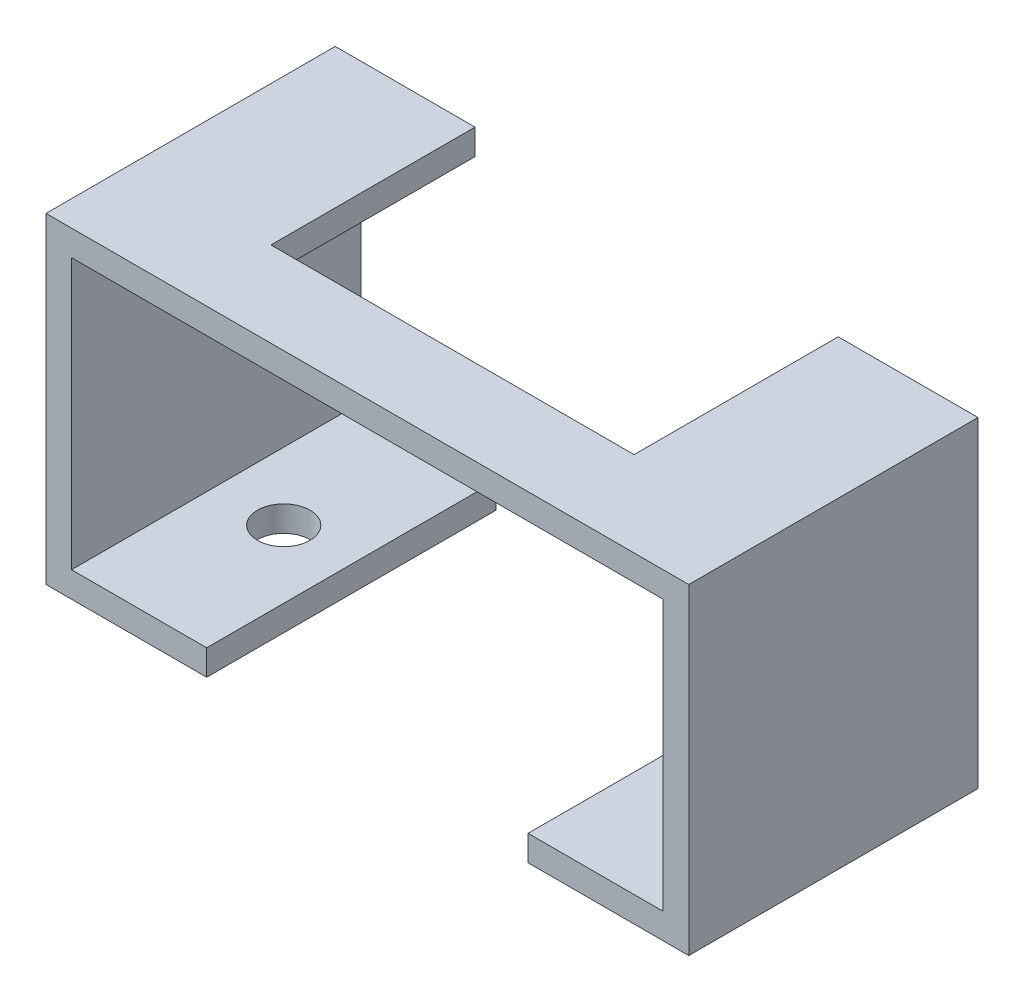
ISO-10303-21;
HEADER;
FILE_DESCRIPTION(('STEP AP214'),'2;1');
FILE_NAME('part.step','',(''),(''),'','','');
FILE_SCHEMA(('AUTOMOTIVE_DESIGN { 1 0 10303 214 1 1 1 1 }'));
ENDSEC;
DATA;
#1=APPLICATION_CONTEXT('core data for automotive mechanical design processes');
#2=APPLICATION_PROTOCOL_DEFINITION('international standard','automotive_design',2000,#1);
#3=PRODUCT_CONTEXT('',#1,'mechanical');
#4=PRODUCT('Part','Part','',(#3));
#5=PRODUCT_RELATED_PRODUCT_CATEGORY('part','',(#4));
#6=PRODUCT_DEFINITION_FORMATION('','',#4);
#7=PRODUCT_DEFINITION_CONTEXT('part definition',#1,'design');
#8=PRODUCT_DEFINITION('design','',#6,#7);
#9=PRODUCT_DEFINITION_SHAPE('','',#8);
#10=(LENGTH_UNIT() NAMED_UNIT(*) SI_UNIT(.MILLI.,.METRE.));
#11=(NAMED_UNIT(*) PLANE_ANGLE_UNIT() SI_UNIT($,.RADIAN.));
#12=(NAMED_UNIT(*) SI_UNIT($,.STERADIAN.) SOLID_ANGLE_UNIT());
#13=UNCERTAINTY_MEASURE_WITH_UNIT(LENGTH_MEASURE(1.E-05),#10,'distance_accuracy_value','');
#14=(GEOMETRIC_REPRESENTATION_CONTEXT(3) GLOBAL_UNCERTAINTY_ASSIGNED_CONTEXT((#13)) GLOBAL_UNIT_ASSIGNED_CONTEXT((#10,
#11,#12)) REPRESENTATION_CONTEXT('',''));
#15=CARTESIAN_POINT('',(0.,0.,0.));
#16=DIRECTION('',(0.,0.,1.));
#17=DIRECTION('',(1.,0.,0.));
#18=AXIS2_PLACEMENT_3D('',#15,#16,#17);
#19=CARTESIAN_POINT('',(0.,0.,0.));
#20=DIRECTION('',(0.,0.,1.));
#21=DIRECTION('',(1.,0.,0.));
#22=AXIS2_PLACEMENT_3D('',#19,#20,#21);
#23=PLANE('',#22);
#24=DIRECTION('',(1.,0.,0.));
#25=VECTOR('',#24,1.);
#26=CARTESIAN_POINT('',(1.59,-1.59,0.));
#27=LINE('',#26,#25);
#28=CARTESIAN_POINT('',(31.3,-1.59,0.));
#29=VERTEX_POINT('',#28);
#30=CARTESIAN_POINT('',(38.41,-1.59,0.));
#31=VERTEX_POINT('',#30);
#32=EDGE_CURVE('E175',#29,#31,#27,.T.);
#33=ORIENTED_EDGE('',*,*,#32,.F.);
#34=DIRECTION('',(0.,1.,0.));
#35=VECTOR('',#34,1.);
#36=CARTESIAN_POINT('',(31.3,0.,0.));
#37=LINE('',#36,#35);
#38=CARTESIAN_POINT('',(31.3,0.,0.));
#39=VERTEX_POINT('',#38);
#40=EDGE_CURVE('E11',#29,#39,#37,.T.);
#41=ORIENTED_EDGE('',*,*,#40,.T.);
#42=DIRECTION('',(-1.,0.,0.));
#43=VECTOR('',#42,1.);
#44=CARTESIAN_POINT('',(0.,0.,0.));
#45=LINE('',#44,#43);
#46=CARTESIAN_POINT('',(40.,0.,0.));
#47=VERTEX_POINT('',#46);
#48=EDGE_CURVE('E189',#47,#39,#45,.T.);
#49=ORIENTED_EDGE('',*,*,#48,.F.);
#50=DIRECTION('',(0.,1.,0.));
#51=VECTOR('',#50,1.);
#52=CARTESIAN_POINT('',(40.,0.,0.));
#53=LINE('',#52,#51);
#54=CARTESIAN_POINT('',(40.,-20.,0.));
#55=VERTEX_POINT('',#54);
#56=EDGE_CURVE('E187',#55,#47,#53,.T.);
#57=ORIENTED_EDGE('',*,*,#56,.F.);
#58=DIRECTION('',(1.,0.,0.));
#59=VECTOR('',#58,1.);
#60=CARTESIAN_POINT('',(40.,-20.,0.));
#61=LINE('',#60,#59);
#62=CARTESIAN_POINT('',(30.,-20.,0.));
#63=VERTEX_POINT('',#62);
#64=EDGE_CURVE('E185',#63,#55,#61,.T.);
#65=ORIENTED_EDGE('',*,*,#64,.F.);
#66=DIRECTION('',(0.,-1.,0.));
#67=VECTOR('',#66,1.);
#68=CARTESIAN_POINT('',(30.,-20.,0.));
#69=LINE('',#68,#67);
#70=CARTESIAN_POINT('',(30.,-18.41,0.));
#71=VERTEX_POINT('',#70);
#72=EDGE_CURVE('E183',#71,#63,#69,.T.);
#73=ORIENTED_EDGE('',*,*,#72,.F.);
#74=DIRECTION('',(-1.,0.,0.));
#75=VECTOR('',#74,1.);
#76=CARTESIAN_POINT('',(38.41,-18.41,0.));
#77=LINE('',#76,#75);
#78=CARTESIAN_POINT('',(38.41,-18.41,0.));
#79=VERTEX_POINT('',#78);
#80=EDGE_CURVE('E181',#79,#71,#77,.T.);
#81=ORIENTED_EDGE('',*,*,#80,.F.);
#82=DIRECTION('',(0.,-1.,0.));
#83=VECTOR('',#82,1.);
#84=CARTESIAN_POINT('',(38.41,-1.59,0.));
#85=LINE('',#84,#83);
#86=EDGE_CURVE('E179',#31,#79,#85,.T.);
#87=ORIENTED_EDGE('',*,*,#86,.F.);
#88=EDGE_LOOP('',(#33,#41,#49,#57,#65,#73,#81,#87));
#89=FACE_BOUND('',#88,.T.);
#90=ADVANCED_FACE('F32',(#89),#23,.F.);
#91=CARTESIAN_POINT('',(10.,-20.,18.));
#92=DIRECTION('',(-1.,0.,0.));
#93=DIRECTION('',(0.,0.,1.));
#94=AXIS2_PLACEMENT_3D('',#91,#92,#93);
#95=PLANE('',#94);
#96=DIRECTION('',(0.,1.,0.));
#97=VECTOR('',#96,1.);
#98=CARTESIAN_POINT('',(10.,-20.,0.));
#99=LINE('',#98,#97);
#100=CARTESIAN_POINT('',(10.,-20.,0.));
#101=VERTEX_POINT('',#100);
#102=CARTESIAN_POINT('',(10.,-18.41,0.));
#103=VERTEX_POINT('',#102);
#104=EDGE_CURVE('E167',#101,#103,#99,.T.);
#105=ORIENTED_EDGE('',*,*,#104,.T.);
#106=DIRECTION('',(0.,0.,-1.));
#107=VECTOR('',#106,1.);
#108=CARTESIAN_POINT('',(10.,-18.41,18.));
#109=LINE('',#108,#107);
#110=CARTESIAN_POINT('',(10.,-18.41,18.));
#111=VERTEX_POINT('',#110);
#112=EDGE_CURVE('E219',#111,#103,#109,.T.);
#113=ORIENTED_EDGE('',*,*,#112,.F.);
#114=DIRECTION('',(0.,1.,0.));
#115=VECTOR('',#114,1.);
#116=CARTESIAN_POINT('',(10.,-20.,18.));
#117=LINE('',#116,#115);
#118=CARTESIAN_POINT('',(10.,-20.,18.));
#119=VERTEX_POINT('',#118);
#120=EDGE_CURVE('E194',#119,#111,#117,.T.);
#121=ORIENTED_EDGE('',*,*,#120,.F.);
#122=DIRECTION('',(0.,0.,-1.));
#123=VECTOR('',#122,1.);
#124=CARTESIAN_POINT('',(10.,-20.,18.));
#125=LINE('',#124,#123);
#126=EDGE_CURVE('E163',#119,#101,#125,.T.);
#127=ORIENTED_EDGE('',*,*,#126,.T.);
#128=EDGE_LOOP('',(#105,#113,#121,#127));
#129=FACE_BOUND('',#128,.T.);
#130=ADVANCED_FACE('F34',(#129),#95,.F.);
#131=CARTESIAN_POINT('',(10.,-18.41,18.));
#132=DIRECTION('',(0.,-1.,0.));
#133=DIRECTION('',(0.,0.,-1.));
#134=AXIS2_PLACEMENT_3D('',#131,#132,#133);
#135=PLANE('',#134);
#136=CARTESIAN_POINT('',(5.795,-18.41,9.));
#137=DIRECTION('',(0.,1.,0.));
#138=DIRECTION('',(0.,0.,1.));
#139=AXIS2_PLACEMENT_3D('',#136,#137,#138);
#140=CIRCLE('',#139,1.63194999999999);
#141=CARTESIAN_POINT('',(5.795,-18.41,10.63195));
#142=VERTEX_POINT('',#141);
#143=EDGE_CURVE('E302',#142,#142,#140,.T.);
#144=ORIENTED_EDGE('',*,*,#143,.F.);
#145=EDGE_LOOP('',(#144));
#146=FACE_BOUND('',#145,.T.);
#147=DIRECTION('',(-1.,0.,0.));
#148=VECTOR('',#147,1.);
#149=CARTESIAN_POINT('',(10.,-18.41,0.));
#150=LINE('',#149,#148);
#151=CARTESIAN_POINT('',(1.59,-18.41,0.));
#152=VERTEX_POINT('',#151);
#153=EDGE_CURVE('E170',#103,#152,#150,.T.);
#154=ORIENTED_EDGE('',*,*,#153,.T.);
#155=DIRECTION('',(0.,0.,-1.));
#156=VECTOR('',#155,1.);
#157=CARTESIAN_POINT('',(1.59,-18.41,18.));
#158=LINE('',#157,#156);
#159=CARTESIAN_POINT('',(1.59,-18.41,18.));
#160=VERTEX_POINT('',#159);
#161=EDGE_CURVE('E216',#160,#152,#158,.T.);
#162=ORIENTED_EDGE('',*,*,#161,.F.);
#163=DIRECTION('',(-1.,0.,0.));
#164=VECTOR('',#163,1.);
#165=CARTESIAN_POINT('',(10.,-18.41,18.));
#166=LINE('',#165,#164);
#167=EDGE_CURVE('E110',#111,#160,#166,.T.);
#168=ORIENTED_EDGE('',*,*,#167,.F.);
#169=ORIENTED_EDGE('',*,*,#112,.T.);
#170=EDGE_LOOP('',(#154,#162,#168,#169));
#171=FACE_BOUND('',#170,.T.);
#172=ADVANCED_FACE('F240',(#146,#171),#135,.F.);
#173=CARTESIAN_POINT('',(1.59,-18.41,18.));
#174=DIRECTION('',(-1.,0.,0.));
#175=DIRECTION('',(0.,-1.,0.));
#176=AXIS2_PLACEMENT_3D('',#173,#174,#175);
#177=PLANE('',#176);
#178=DIRECTION('',(0.,1.,0.));
#179=VECTOR('',#178,1.);
#180=CARTESIAN_POINT('',(1.59,-18.41,0.));
#181=LINE('',#180,#179);
#182=CARTESIAN_POINT('',(1.59,-1.59,0.));
#183=VERTEX_POINT('',#182);
#184=EDGE_CURVE('E173',#152,#183,#181,.T.);
#185=ORIENTED_EDGE('',*,*,#184,.T.);
#186=DIRECTION('',(0.,0.,-1.));
#187=VECTOR('',#186,1.);
#188=CARTESIAN_POINT('',(1.59,-1.59,18.));
#189=LINE('',#188,#187);
#190=CARTESIAN_POINT('',(1.59,-1.59,18.));
#191=VERTEX_POINT('',#190);
#192=EDGE_CURVE('E213',#191,#183,#189,.T.);
#193=ORIENTED_EDGE('',*,*,#192,.F.);
#194=DIRECTION('',(0.,1.,0.));
#195=VECTOR('',#194,1.);
#196=CARTESIAN_POINT('',(1.59,-18.41,18.));
#197=LINE('',#196,#195);
#198=EDGE_CURVE('E237',#160,#191,#197,.T.);
#199=ORIENTED_EDGE('',*,*,#198,.F.);
#200=ORIENTED_EDGE('',*,*,#161,.T.);
#201=EDGE_LOOP('',(#185,#193,#199,#200));
#202=FACE_BOUND('',#201,.T.);
#203=ADVANCED_FACE('F236',(#202),#177,.F.);
#204=CARTESIAN_POINT('',(1.59,-1.59,18.));
#205=DIRECTION('',(0.,1.,0.));
#206=DIRECTION('',(0.,0.,1.));
#207=AXIS2_PLACEMENT_3D('',#204,#205,#206);
#208=PLANE('',#207);
#209=DIRECTION('',(1.,0.,0.));
#210=VECTOR('',#209,1.);
#211=CARTESIAN_POINT('',(1.59,-1.59,12.7));
#212=LINE('',#211,#210);
#213=CARTESIAN_POINT('',(8.7,-1.59,12.7));
#214=VERTEX_POINT('',#213);
#215=CARTESIAN_POINT('',(31.3,-1.59,12.7));
#216=VERTEX_POINT('',#215);
#217=EDGE_CURVE('E171',#214,#216,#212,.T.);
#218=ORIENTED_EDGE('',*,*,#217,.T.);
#219=DIRECTION('',(0.,0.,-1.));
#220=VECTOR('',#219,1.);
#221=CARTESIAN_POINT('',(31.3,-1.59,18.));
#222=LINE('',#221,#220);
#223=EDGE_CURVE('E319',#216,#29,#222,.T.);
#224=ORIENTED_EDGE('',*,*,#223,.T.);
#225=ORIENTED_EDGE('',*,*,#32,.T.);
#226=DIRECTION('',(0.,0.,-1.));
#227=VECTOR('',#226,1.);
#228=CARTESIAN_POINT('',(38.41,-1.59,18.));
#229=LINE('',#228,#227);
#230=CARTESIAN_POINT('',(38.41,-1.59,18.));
#231=VERTEX_POINT('',#230);
#232=EDGE_CURVE('E210',#231,#31,#229,.T.);
#233=ORIENTED_EDGE('',*,*,#232,.F.);
#234=DIRECTION('',(1.,0.,0.));
#235=VECTOR('',#234,1.);
#236=CARTESIAN_POINT('',(1.59,-1.59,18.));
#237=LINE('',#236,#235);
#238=EDGE_CURVE('E233',#191,#231,#237,.T.);
#239=ORIENTED_EDGE('',*,*,#238,.F.);
#240=ORIENTED_EDGE('',*,*,#192,.T.);
#241=CARTESIAN_POINT('',(8.7,-1.59,0.));
#242=VERTEX_POINT('',#241);
#243=EDGE_CURVE('E176',#183,#242,#27,.T.);
#244=ORIENTED_EDGE('',*,*,#243,.T.);
#245=DIRECTION('',(0.,0.,1.));
#246=VECTOR('',#245,1.);
#247=CARTESIAN_POINT('',(8.7,-1.59,18.));
#248=LINE('',#247,#246);
#249=EDGE_CURVE('E47',#242,#214,#248,.T.);
#250=ORIENTED_EDGE('',*,*,#249,.T.);
#251=EDGE_LOOP('',(#218,#224,#225,#233,#239,#240,#244,#250));
#252=FACE_BOUND('',#251,.T.);
#253=ADVANCED_FACE('F228',(#252),#208,.F.);
#254=CARTESIAN_POINT('',(38.41,-1.59,18.));
#255=DIRECTION('',(1.,0.,0.));
#256=DIRECTION('',(0.,0.,-1.));
#257=AXIS2_PLACEMENT_3D('',#254,#255,#256);
#258=PLANE('',#257);
#259=ORIENTED_EDGE('',*,*,#86,.T.);
#260=DIRECTION('',(0.,0.,-1.));
#261=VECTOR('',#260,1.);
#262=CARTESIAN_POINT('',(38.41,-18.41,18.));
#263=LINE('',#262,#261);
#264=CARTESIAN_POINT('',(38.41,-18.41,18.));
#265=VERTEX_POINT('',#264);
#266=EDGE_CURVE('E207',#265,#79,#263,.T.);
#267=ORIENTED_EDGE('',*,*,#266,.F.);
#268=DIRECTION('',(0.,-1.,0.));
#269=VECTOR('',#268,1.);
#270=CARTESIAN_POINT('',(38.41,-1.59,18.));
#271=LINE('',#270,#269);
#272=EDGE_CURVE('E327',#231,#265,#271,.T.);
#273=ORIENTED_EDGE('',*,*,#272,.F.);
#274=ORIENTED_EDGE('',*,*,#232,.T.);
#275=EDGE_LOOP('',(#259,#267,#273,#274));
#276=FACE_BOUND('',#275,.T.);
#277=ADVANCED_FACE('F363',(#276),#258,.F.);
#278=CARTESIAN_POINT('',(38.41,-18.41,18.));
#279=DIRECTION('',(0.,-1.,0.));
#280=DIRECTION('',(0.,0.,-1.));
#281=AXIS2_PLACEMENT_3D('',#278,#279,#280);
#282=PLANE('',#281);
#283=CARTESIAN_POINT('',(34.205,-18.41,9.));
#284=DIRECTION('',(0.,1.,0.));
#285=DIRECTION('',(0.,0.,1.));
#286=AXIS2_PLACEMENT_3D('',#283,#284,#285);
#287=CIRCLE('',#286,1.63194999999999);
#288=CARTESIAN_POINT('',(34.205,-18.41,10.63195));
#289=VERTEX_POINT('',#288);
#290=EDGE_CURVE('E296',#289,#289,#287,.T.);
#291=ORIENTED_EDGE('',*,*,#290,.F.);
#292=EDGE_LOOP('',(#291));
#293=FACE_BOUND('',#292,.T.);
#294=ORIENTED_EDGE('',*,*,#80,.T.);
#295=DIRECTION('',(0.,0.,-1.));
#296=VECTOR('',#295,1.);
#297=CARTESIAN_POINT('',(30.,-18.41,18.));
#298=LINE('',#297,#296);
#299=CARTESIAN_POINT('',(30.,-18.41,18.));
#300=VERTEX_POINT('',#299);
#301=EDGE_CURVE('E204',#300,#71,#298,.T.);
#302=ORIENTED_EDGE('',*,*,#301,.F.);
#303=DIRECTION('',(-1.,0.,0.));
#304=VECTOR('',#303,1.);
#305=CARTESIAN_POINT('',(38.41,-18.41,18.));
#306=LINE('',#305,#304);
#307=EDGE_CURVE('E329',#265,#300,#306,.T.);
#308=ORIENTED_EDGE('',*,*,#307,.F.);
#309=ORIENTED_EDGE('',*,*,#266,.T.);
#310=EDGE_LOOP('',(#294,#302,#308,#309));
#311=FACE_BOUND('',#310,.T.);
#312=ADVANCED_FACE('F369',(#293,#311),#282,.F.);
#313=CARTESIAN_POINT('',(30.,-20.,18.));
#314=DIRECTION('',(1.,0.,0.));
#315=DIRECTION('',(0.,0.,-1.));
#316=AXIS2_PLACEMENT_3D('',#313,#314,#315);
#317=PLANE('',#316);
#318=ORIENTED_EDGE('',*,*,#72,.T.);
#319=DIRECTION('',(0.,0.,-1.));
#320=VECTOR('',#319,1.);
#321=CARTESIAN_POINT('',(30.,-20.,18.));
#322=LINE('',#321,#320);
#323=CARTESIAN_POINT('',(30.,-20.,18.));
#324=VERTEX_POINT('',#323);
#325=EDGE_CURVE('E201',#324,#63,#322,.T.);
#326=ORIENTED_EDGE('',*,*,#325,.F.);
#327=DIRECTION('',(0.,-1.,0.));
#328=VECTOR('',#327,1.);
#329=CARTESIAN_POINT('',(30.,-20.,18.));
#330=LINE('',#329,#328);
#331=EDGE_CURVE('E331',#300,#324,#330,.T.);
#332=ORIENTED_EDGE('',*,*,#331,.F.);
#333=ORIENTED_EDGE('',*,*,#301,.T.);
#334=EDGE_LOOP('',(#318,#326,#332,#333));
#335=FACE_BOUND('',#334,.T.);
#336=ADVANCED_FACE('F372',(#335),#317,.F.);
#337=CARTESIAN_POINT('',(40.,-20.,18.));
#338=DIRECTION('',(0.,1.,0.));
#339=DIRECTION('',(-1.,0.,0.));
#340=AXIS2_PLACEMENT_3D('',#337,#338,#339);
#341=PLANE('',#340);
#342=CARTESIAN_POINT('',(34.205,-20.,9.));
#343=DIRECTION('',(0.,1.,0.));
#344=DIRECTION('',(-1.,0.,0.));
#345=AXIS2_PLACEMENT_3D('',#342,#343,#344);
#346=CIRCLE('',#345,1.63194999999999);
#347=CARTESIAN_POINT('',(32.57305,-20.,9.));
#348=VERTEX_POINT('',#347);
#349=EDGE_CURVE('E293',#348,#348,#346,.T.);
#350=ORIENTED_EDGE('',*,*,#349,.T.);
#351=EDGE_LOOP('',(#350));
#352=FACE_BOUND('',#351,.T.);
#353=ORIENTED_EDGE('',*,*,#64,.T.);
#354=DIRECTION('',(0.,0.,-1.));
#355=VECTOR('',#354,1.);
#356=CARTESIAN_POINT('',(40.,-20.,18.));
#357=LINE('',#356,#355);
#358=CARTESIAN_POINT('',(40.,-20.,18.));
#359=VERTEX_POINT('',#358);
#360=EDGE_CURVE('E198',#359,#55,#357,.T.);
#361=ORIENTED_EDGE('',*,*,#360,.F.);
#362=DIRECTION('',(1.,0.,0.));
#363=VECTOR('',#362,1.);
#364=CARTESIAN_POINT('',(40.,-20.,18.));
#365=LINE('',#364,#363);
#366=EDGE_CURVE('E333',#324,#359,#365,.T.);
#367=ORIENTED_EDGE('',*,*,#366,.F.);
#368=ORIENTED_EDGE('',*,*,#325,.T.);
#369=EDGE_LOOP('',(#353,#361,#367,#368));
#370=FACE_BOUND('',#369,.T.);
#371=ADVANCED_FACE('F339',(#352,#370),#341,.F.);
#372=CARTESIAN_POINT('',(40.,0.,18.));
#373=DIRECTION('',(-1.,0.,0.));
#374=DIRECTION('',(0.,-1.,0.));
#375=AXIS2_PLACEMENT_3D('',#372,#373,#374);
#376=PLANE('',#375);
#377=ORIENTED_EDGE('',*,*,#56,.T.);
#378=DIRECTION('',(0.,0.,-1.));
#379=VECTOR('',#378,1.);
#380=CARTESIAN_POINT('',(40.,0.,18.));
#381=LINE('',#380,#379);
#382=CARTESIAN_POINT('',(40.,0.,18.));
#383=VERTEX_POINT('',#382);
#384=EDGE_CURVE('E158',#383,#47,#381,.T.);
#385=ORIENTED_EDGE('',*,*,#384,.F.);
#386=DIRECTION('',(0.,1.,0.));
#387=VECTOR('',#386,1.);
#388=CARTESIAN_POINT('',(40.,0.,18.));
#389=LINE('',#388,#387);
#390=EDGE_CURVE('E144',#359,#383,#389,.T.);
#391=ORIENTED_EDGE('',*,*,#390,.F.);
#392=ORIENTED_EDGE('',*,*,#360,.T.);
#393=EDGE_LOOP('',(#377,#385,#391,#392));
#394=FACE_BOUND('',#393,.T.);
#395=ADVANCED_FACE('F343',(#394),#376,.F.);
#396=CARTESIAN_POINT('',(0.,0.,18.));
#397=DIRECTION('',(0.,-1.,0.));
#398=DIRECTION('',(0.,0.,-1.));
#399=AXIS2_PLACEMENT_3D('',#396,#397,#398);
#400=PLANE('',#399);
#401=ORIENTED_EDGE('',*,*,#48,.T.);
#402=DIRECTION('',(0.,0.,-1.));
#403=VECTOR('',#402,1.);
#404=CARTESIAN_POINT('',(31.3,0.,12.7));
#405=LINE('',#404,#403);
#406=CARTESIAN_POINT('',(31.3,0.,12.7));
#407=VERTEX_POINT('',#406);
#408=EDGE_CURVE('E310',#407,#39,#405,.T.);
#409=ORIENTED_EDGE('',*,*,#408,.F.);
#410=DIRECTION('',(1.,0.,0.));
#411=VECTOR('',#410,1.);
#412=CARTESIAN_POINT('',(8.7,0.,12.7));
#413=LINE('',#412,#411);
#414=CARTESIAN_POINT('',(8.7,0.,12.7));
#415=VERTEX_POINT('',#414);
#416=EDGE_CURVE('E307',#415,#407,#413,.T.);
#417=ORIENTED_EDGE('',*,*,#416,.F.);
#418=DIRECTION('',(0.,0.,1.));
#419=VECTOR('',#418,1.);
#420=CARTESIAN_POINT('',(8.7,0.,0.));
#421=LINE('',#420,#419);
#422=CARTESIAN_POINT('',(8.7,0.,0.));
#423=VERTEX_POINT('',#422);
#424=EDGE_CURVE('E300',#423,#415,#421,.T.);
#425=ORIENTED_EDGE('',*,*,#424,.F.);
#426=CARTESIAN_POINT('',(0.,0.,0.));
#427=VERTEX_POINT('',#426);
#428=EDGE_CURVE('E155',#423,#427,#45,.T.);
#429=ORIENTED_EDGE('',*,*,#428,.T.);
#430=DIRECTION('',(0.,0.,-1.));
#431=VECTOR('',#430,1.);
#432=CARTESIAN_POINT('',(0.,0.,18.));
#433=LINE('',#432,#431);
#434=CARTESIAN_POINT('',(0.,0.,18.));
#435=VERTEX_POINT('',#434);
#436=EDGE_CURVE('E150',#435,#427,#433,.T.);
#437=ORIENTED_EDGE('',*,*,#436,.F.);
#438=DIRECTION('',(-1.,0.,0.));
#439=VECTOR('',#438,1.);
#440=CARTESIAN_POINT('',(0.,0.,18.));
#441=LINE('',#440,#439);
#442=EDGE_CURVE('E137',#383,#435,#441,.T.);
#443=ORIENTED_EDGE('',*,*,#442,.F.);
#444=ORIENTED_EDGE('',*,*,#384,.T.);
#445=EDGE_LOOP('',(#401,#409,#417,#425,#429,#437,#443,#444));
#446=FACE_BOUND('',#445,.T.);
#447=ADVANCED_FACE('F152',(#446),#400,.F.);
#448=CARTESIAN_POINT('',(0.,-20.,18.));
#449=DIRECTION('',(1.,0.,0.));
#450=DIRECTION('',(0.,0.,-1.));
#451=AXIS2_PLACEMENT_3D('',#448,#449,#450);
#452=PLANE('',#451);
#453=DIRECTION('',(0.,-1.,0.));
#454=VECTOR('',#453,1.);
#455=CARTESIAN_POINT('',(0.,-20.,0.));
#456=LINE('',#455,#454);
#457=CARTESIAN_POINT('',(0.,-20.,0.));
#458=VERTEX_POINT('',#457);
#459=EDGE_CURVE('E191',#427,#458,#456,.T.);
#460=ORIENTED_EDGE('',*,*,#459,.T.);
#461=DIRECTION('',(0.,0.,-1.));
#462=VECTOR('',#461,1.);
#463=CARTESIAN_POINT('',(0.,-20.,18.));
#464=LINE('',#463,#462);
#465=CARTESIAN_POINT('',(0.,-20.,18.));
#466=VERTEX_POINT('',#465);
#467=EDGE_CURVE('E159',#466,#458,#464,.T.);
#468=ORIENTED_EDGE('',*,*,#467,.F.);
#469=DIRECTION('',(0.,-1.,0.));
#470=VECTOR('',#469,1.);
#471=CARTESIAN_POINT('',(0.,-20.,18.));
#472=LINE('',#471,#470);
#473=EDGE_CURVE('E141',#435,#466,#472,.T.);
#474=ORIENTED_EDGE('',*,*,#473,.F.);
#475=ORIENTED_EDGE('',*,*,#436,.T.);
#476=EDGE_LOOP('',(#460,#468,#474,#475));
#477=FACE_BOUND('',#476,.T.);
#478=ADVANCED_FACE('F161',(#477),#452,.F.);
#479=CARTESIAN_POINT('',(10.,-20.,18.));
#480=DIRECTION('',(0.,1.,0.));
#481=DIRECTION('',(-1.,0.,0.));
#482=AXIS2_PLACEMENT_3D('',#479,#480,#481);
#483=PLANE('',#482);
#484=CARTESIAN_POINT('',(5.795,-20.,9.));
#485=DIRECTION('',(0.,1.,0.));
#486=DIRECTION('',(-1.,0.,0.));
#487=AXIS2_PLACEMENT_3D('',#484,#485,#486);
#488=CIRCLE('',#487,1.63194999999999);
#489=CARTESIAN_POINT('',(4.16305,-20.,9.));
#490=VERTEX_POINT('',#489);
#491=EDGE_CURVE('E298',#490,#490,#488,.T.);
#492=ORIENTED_EDGE('',*,*,#491,.T.);
#493=EDGE_LOOP('',(#492));
#494=FACE_BOUND('',#493,.T.);
#495=DIRECTION('',(1.,0.,0.));
#496=VECTOR('',#495,1.);
#497=CARTESIAN_POINT('',(10.,-20.,0.));
#498=LINE('',#497,#496);
#499=EDGE_CURVE('E101',#458,#101,#498,.T.);
#500=ORIENTED_EDGE('',*,*,#499,.T.);
#501=ORIENTED_EDGE('',*,*,#126,.F.);
#502=DIRECTION('',(1.,0.,0.));
#503=VECTOR('',#502,1.);
#504=CARTESIAN_POINT('',(10.,-20.,18.));
#505=LINE('',#504,#503);
#506=EDGE_CURVE('E56',#466,#119,#505,.T.);
#507=ORIENTED_EDGE('',*,*,#506,.F.);
#508=ORIENTED_EDGE('',*,*,#467,.T.);
#509=EDGE_LOOP('',(#500,#501,#507,#508));
#510=FACE_BOUND('',#509,.T.);
#511=ADVANCED_FACE('F243',(#494,#510),#483,.F.);
#512=CARTESIAN_POINT('',(0.,0.,18.));
#513=DIRECTION('',(0.,0.,1.));
#514=DIRECTION('',(1.,0.,0.));
#515=AXIS2_PLACEMENT_3D('',#512,#513,#514);
#516=PLANE('',#515);
#517=ORIENTED_EDGE('',*,*,#120,.T.);
#518=ORIENTED_EDGE('',*,*,#167,.T.);
#519=ORIENTED_EDGE('',*,*,#198,.T.);
#520=ORIENTED_EDGE('',*,*,#238,.T.);
#521=ORIENTED_EDGE('',*,*,#272,.T.);
#522=ORIENTED_EDGE('',*,*,#307,.T.);
#523=ORIENTED_EDGE('',*,*,#331,.T.);
#524=ORIENTED_EDGE('',*,*,#366,.T.);
#525=ORIENTED_EDGE('',*,*,#390,.T.);
#526=ORIENTED_EDGE('',*,*,#442,.T.);
#527=ORIENTED_EDGE('',*,*,#473,.T.);
#528=ORIENTED_EDGE('',*,*,#506,.T.);
#529=EDGE_LOOP('',(#517,#518,#519,#520,#521,#522,#523,#524,#525,#526,#527,#528));
#530=FACE_BOUND('',#529,.T.);
#531=ADVANCED_FACE('F139',(#530),#516,.T.);
#532=ORIENTED_EDGE('',*,*,#428,.F.);
#533=DIRECTION('',(0.,-1.,0.));
#534=VECTOR('',#533,1.);
#535=CARTESIAN_POINT('',(8.7,0.,0.));
#536=LINE('',#535,#534);
#537=EDGE_CURVE('E40',#423,#242,#536,.T.);
#538=ORIENTED_EDGE('',*,*,#537,.T.);
#539=ORIENTED_EDGE('',*,*,#243,.F.);
#540=ORIENTED_EDGE('',*,*,#184,.F.);
#541=ORIENTED_EDGE('',*,*,#153,.F.);
#542=ORIENTED_EDGE('',*,*,#104,.F.);
#543=ORIENTED_EDGE('',*,*,#499,.F.);
#544=ORIENTED_EDGE('',*,*,#459,.F.);
#545=EDGE_LOOP('',(#532,#538,#539,#540,#541,#542,#543,#544));
#546=FACE_BOUND('',#545,.T.);
#547=ADVANCED_FACE('F222',(#546),#23,.F.);
#548=CARTESIAN_POINT('',(8.7,-10.,12.7));
#549=DIRECTION('',(0.,0.,1.));
#550=DIRECTION('',(1.,0.,0.));
#551=AXIS2_PLACEMENT_3D('',#548,#549,#550);
#552=PLANE('',#551);
#553=DIRECTION('',(0.,1.,0.));
#554=VECTOR('',#553,1.);
#555=CARTESIAN_POINT('',(8.7,-10.,12.7));
#556=LINE('',#555,#554);
#557=EDGE_CURVE('E313',#214,#415,#556,.T.);
#558=ORIENTED_EDGE('',*,*,#557,.T.);
#559=ORIENTED_EDGE('',*,*,#416,.T.);
#560=DIRECTION('',(0.,1.,0.));
#561=VECTOR('',#560,1.);
#562=CARTESIAN_POINT('',(31.3,-10.,12.7));
#563=LINE('',#562,#561);
#564=EDGE_CURVE('E314',#216,#407,#563,.T.);
#565=ORIENTED_EDGE('',*,*,#564,.F.);
#566=ORIENTED_EDGE('',*,*,#217,.F.);
#567=EDGE_LOOP('',(#558,#559,#565,#566));
#568=FACE_BOUND('',#567,.T.);
#569=ADVANCED_FACE('F262',(#568),#552,.F.);
#570=CARTESIAN_POINT('',(31.3,-10.,12.7));
#571=DIRECTION('',(1.,0.,0.));
#572=DIRECTION('',(0.,0.,-1.));
#573=AXIS2_PLACEMENT_3D('',#570,#571,#572);
#574=PLANE('',#573);
#575=ORIENTED_EDGE('',*,*,#564,.T.);
#576=ORIENTED_EDGE('',*,*,#408,.T.);
#577=ORIENTED_EDGE('',*,*,#40,.F.);
#578=ORIENTED_EDGE('',*,*,#223,.F.);
#579=EDGE_LOOP('',(#575,#576,#577,#578));
#580=FACE_BOUND('',#579,.T.);
#581=ADVANCED_FACE('F266',(#580),#574,.F.);
#582=CARTESIAN_POINT('',(8.7,-10.,0.));
#583=DIRECTION('',(-1.,0.,0.));
#584=DIRECTION('',(0.,0.,1.));
#585=AXIS2_PLACEMENT_3D('',#582,#583,#584);
#586=PLANE('',#585);
#587=ORIENTED_EDGE('',*,*,#537,.F.);
#588=ORIENTED_EDGE('',*,*,#424,.T.);
#589=ORIENTED_EDGE('',*,*,#557,.F.);
#590=ORIENTED_EDGE('',*,*,#249,.F.);
#591=EDGE_LOOP('',(#587,#588,#589,#590));
#592=FACE_BOUND('',#591,.T.);
#593=ADVANCED_FACE('F272',(#592),#586,.F.);
#594=CARTESIAN_POINT('',(34.205,-18.41,9.));
#595=DIRECTION('',(0.,1.,0.));
#596=DIRECTION('',(0.,0.,1.));
#597=AXIS2_PLACEMENT_3D('',#594,#595,#596);
#598=CYLINDRICAL_SURFACE('',#597,1.63194999999999);
#599=ORIENTED_EDGE('',*,*,#349,.F.);
#600=EDGE_LOOP('',(#599));
#601=FACE_BOUND('',#600,.T.);
#602=ORIENTED_EDGE('',*,*,#290,.T.);
#603=EDGE_LOOP('',(#602));
#604=FACE_BOUND('',#603,.T.);
#605=ADVANCED_FACE('F279',(#601,#604),#598,.F.);
#606=CARTESIAN_POINT('',(5.795,-18.41,9.));
#607=DIRECTION('',(0.,1.,0.));
#608=DIRECTION('',(0.,0.,1.));
#609=AXIS2_PLACEMENT_3D('',#606,#607,#608);
#610=CYLINDRICAL_SURFACE('',#609,1.63194999999999);
#611=ORIENTED_EDGE('',*,*,#491,.F.);
#612=EDGE_LOOP('',(#611));
#613=FACE_BOUND('',#612,.T.);
#614=ORIENTED_EDGE('',*,*,#143,.T.);
#615=EDGE_LOOP('',(#614));
#616=FACE_BOUND('',#615,.T.);
#617=ADVANCED_FACE('F283',(#613,#616),#610,.F.);
#618=CLOSED_SHELL('',(#90,#130,#172,#203,#253,#277,#312,#336,#371,#395,#447,#478,#511,#531,#547,
#569,#581,#593,#605,#617));
#619=MANIFOLD_SOLID_BREP('B2',#618);
#620=ADVANCED_BREP_SHAPE_REPRESENTATION('',(#18,#619),#14);
#621=SHAPE_DEFINITION_REPRESENTATION(#9,#620);
ENDSEC;
END-ISO-10303-21;
